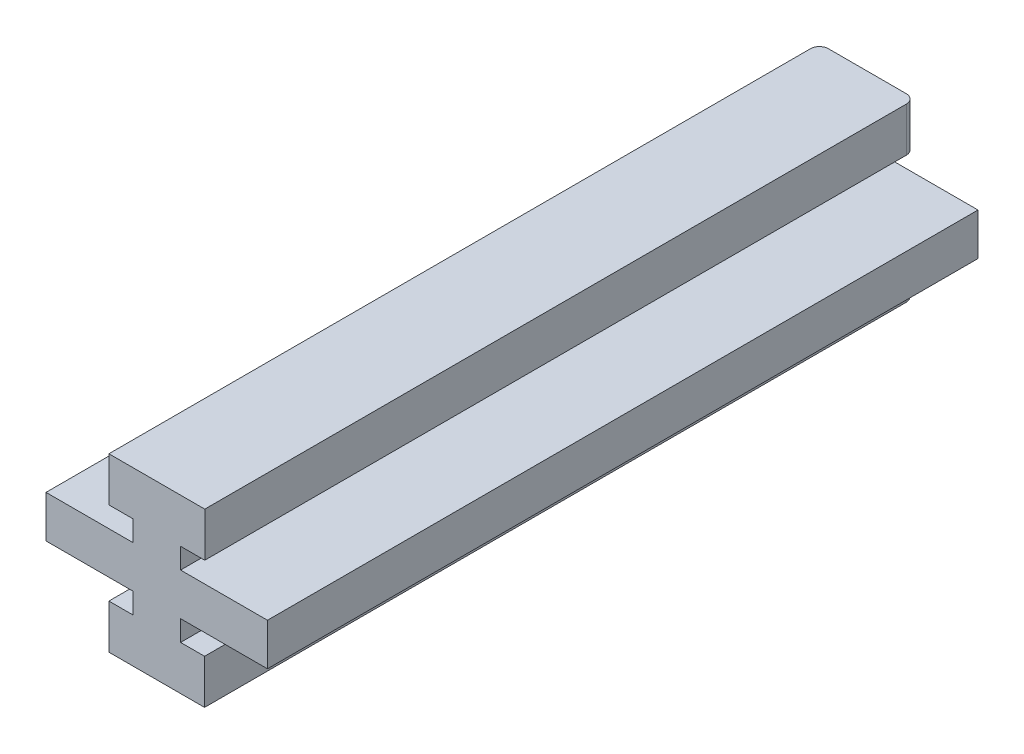
ISO-10303-21;
HEADER;
FILE_DESCRIPTION(('STEP AP214'),'2;1');
FILE_NAME('part.step','',(''),(''),'','','');
FILE_SCHEMA(('AUTOMOTIVE_DESIGN { 1 0 10303 214 1 1 1 1 }'));
ENDSEC;
DATA;
#1=APPLICATION_CONTEXT('core data for automotive mechanical design processes');
#2=APPLICATION_PROTOCOL_DEFINITION('international standard','automotive_design',2000,#1);
#3=PRODUCT_CONTEXT('',#1,'mechanical');
#4=PRODUCT('Part','Part','',(#3));
#5=PRODUCT_RELATED_PRODUCT_CATEGORY('part','',(#4));
#6=PRODUCT_DEFINITION_FORMATION('','',#4);
#7=PRODUCT_DEFINITION_CONTEXT('part definition',#1,'design');
#8=PRODUCT_DEFINITION('design','',#6,#7);
#9=PRODUCT_DEFINITION_SHAPE('','',#8);
#10=(LENGTH_UNIT() NAMED_UNIT(*) SI_UNIT(.MILLI.,.METRE.));
#11=(NAMED_UNIT(*) PLANE_ANGLE_UNIT() SI_UNIT($,.RADIAN.));
#12=(NAMED_UNIT(*) SI_UNIT($,.STERADIAN.) SOLID_ANGLE_UNIT());
#13=UNCERTAINTY_MEASURE_WITH_UNIT(LENGTH_MEASURE(1.E-05),#10,'distance_accuracy_value','');
#14=(GEOMETRIC_REPRESENTATION_CONTEXT(3) GLOBAL_UNCERTAINTY_ASSIGNED_CONTEXT((#13)) GLOBAL_UNIT_ASSIGNED_CONTEXT((#10,
#11,#12)) REPRESENTATION_CONTEXT('',''));
#15=CARTESIAN_POINT('',(0.,0.,0.));
#16=DIRECTION('',(0.,0.,1.));
#17=DIRECTION('',(1.,0.,0.));
#18=AXIS2_PLACEMENT_3D('',#15,#16,#17);
#19=CARTESIAN_POINT('',(1.34599990199997,0.,0.));
#20=DIRECTION('',(1.,0.,0.));
#21=DIRECTION('',(0.,1.,0.));
#22=AXIS2_PLACEMENT_3D('',#19,#20,#21);
#23=PLANE('',#22);
#24=DIRECTION('',(0.,0.,-1.));
#25=VECTOR('',#24,1.);
#26=CARTESIAN_POINT('',(1.345999902,7.1625483,0.));
#27=LINE('',#26,#25);
#28=CARTESIAN_POINT('',(1.345999902,7.1625483,233.1065878));
#29=VERTEX_POINT('',#28);
#30=CARTESIAN_POINT('',(1.345999902,7.1625483,193.508));
#31=VERTEX_POINT('',#30);
#32=EDGE_CURVE('E280',#29,#31,#27,.T.);
#33=ORIENTED_EDGE('',*,*,#32,.F.);
#34=DIRECTION('',(0.,1.,0.));
#35=VECTOR('',#34,1.);
#36=CARTESIAN_POINT('',(1.34599990199999,6.,233.1065878));
#37=LINE('',#36,#35);
#38=CARTESIAN_POINT('',(1.34599990199999,6.,233.1065878));
#39=VERTEX_POINT('',#38);
#40=EDGE_CURVE('E233',#39,#29,#37,.T.);
#41=ORIENTED_EDGE('',*,*,#40,.F.);
#42=DIRECTION('',(0.,0.,-1.));
#43=VECTOR('',#42,1.);
#44=CARTESIAN_POINT('',(1.34599990199999,6.,225.));
#45=LINE('',#44,#43);
#46=CARTESIAN_POINT('',(1.34599990199999,6.,193.508));
#47=VERTEX_POINT('',#46);
#48=EDGE_CURVE('E342',#39,#47,#45,.T.);
#49=ORIENTED_EDGE('',*,*,#48,.T.);
#50=DIRECTION('',(0.,1.,0.));
#51=VECTOR('',#50,1.);
#52=CARTESIAN_POINT('',(1.345999902,7.627,193.508));
#53=LINE('',#52,#51);
#54=EDGE_CURVE('E365',#47,#31,#53,.T.);
#55=ORIENTED_EDGE('',*,*,#54,.T.);
#56=EDGE_LOOP('',(#33,#41,#49,#55));
#57=FACE_BOUND('',#56,.T.);
#58=ADVANCED_FACE('F36',(#57),#23,.T.);
#59=CARTESIAN_POINT('',(-1.34599990199997,0.,0.));
#60=DIRECTION('',(-1.,0.,0.));
#61=DIRECTION('',(0.,1.,0.));
#62=AXIS2_PLACEMENT_3D('',#59,#60,#61);
#63=PLANE('',#62);
#64=DIRECTION('',(0.,0.,1.));
#65=VECTOR('',#64,1.);
#66=CARTESIAN_POINT('',(-1.34599990199995,7.1625483,0.));
#67=LINE('',#66,#65);
#68=CARTESIAN_POINT('',(-1.34599990199995,7.1625483,193.508));
#69=VERTEX_POINT('',#68);
#70=CARTESIAN_POINT('',(-1.34599990199995,7.1625483,233.1065878));
#71=VERTEX_POINT('',#70);
#72=EDGE_CURVE('E276',#69,#71,#67,.T.);
#73=ORIENTED_EDGE('',*,*,#72,.F.);
#74=DIRECTION('',(0.,-1.,0.));
#75=VECTOR('',#74,1.);
#76=CARTESIAN_POINT('',(-1.34599990199996,6.,193.508));
#77=LINE('',#76,#75);
#78=CARTESIAN_POINT('',(-1.34599990199996,6.,193.508));
#79=VERTEX_POINT('',#78);
#80=EDGE_CURVE('E358',#69,#79,#77,.T.);
#81=ORIENTED_EDGE('',*,*,#80,.T.);
#82=DIRECTION('',(0.,0.,-1.));
#83=VECTOR('',#82,1.);
#84=CARTESIAN_POINT('',(-1.34599990199996,6.,225.));
#85=LINE('',#84,#83);
#86=CARTESIAN_POINT('',(-1.34599990199996,6.,233.1065878));
#87=VERTEX_POINT('',#86);
#88=EDGE_CURVE('E327',#87,#79,#85,.T.);
#89=ORIENTED_EDGE('',*,*,#88,.F.);
#90=DIRECTION('',(0.,-1.,0.));
#91=VECTOR('',#90,1.);
#92=CARTESIAN_POINT('',(-1.34599990199995,7.62700000000001,233.1065878));
#93=LINE('',#92,#91);
#94=EDGE_CURVE('E305',#71,#87,#93,.T.);
#95=ORIENTED_EDGE('',*,*,#94,.F.);
#96=EDGE_LOOP('',(#73,#81,#89,#95));
#97=FACE_BOUND('',#96,.T.);
#98=ADVANCED_FACE('F477',(#97),#63,.T.);
#99=CARTESIAN_POINT('',(-6.25,9.20000000000002,225.));
#100=DIRECTION('',(1.,0.,0.));
#101=DIRECTION('',(0.,-1.,0.));
#102=AXIS2_PLACEMENT_3D('',#99,#100,#101);
#103=PLANE('',#102);
#104=DIRECTION('',(0.,0.,1.));
#105=VECTOR('',#104,1.);
#106=CARTESIAN_POINT('',(-6.25,7.1625483,180.276393350966));
#107=LINE('',#106,#105);
#108=CARTESIAN_POINT('',(-6.25,7.1625483,193.));
#109=VERTEX_POINT('',#108);
#110=CARTESIAN_POINT('',(-6.25,7.1625483,233.1065878));
#111=VERTEX_POINT('',#110);
#112=EDGE_CURVE('E257',#109,#111,#107,.T.);
#113=ORIENTED_EDGE('',*,*,#112,.T.);
#114=DIRECTION('',(0.,-1.,0.));
#115=VECTOR('',#114,1.);
#116=CARTESIAN_POINT('',(-6.25,9.07300000000002,233.1065878));
#117=LINE('',#116,#115);
#118=CARTESIAN_POINT('',(-6.25,9.53745169999998,233.1065878));
#119=VERTEX_POINT('',#118);
#120=EDGE_CURVE('E303',#119,#111,#117,.T.);
#121=ORIENTED_EDGE('',*,*,#120,.F.);
#122=DIRECTION('',(0.,0.,1.));
#123=VECTOR('',#122,1.);
#124=CARTESIAN_POINT('',(-6.25,9.53745169999998,180.276393350966));
#125=LINE('',#124,#123);
#126=CARTESIAN_POINT('',(-6.25,9.53745169999998,193.));
#127=VERTEX_POINT('',#126);
#128=EDGE_CURVE('E241',#127,#119,#125,.T.);
#129=ORIENTED_EDGE('',*,*,#128,.F.);
#130=DIRECTION('',(0.,1.,0.));
#131=VECTOR('',#130,1.);
#132=CARTESIAN_POINT('',(-6.25,7.1625483,193.));
#133=LINE('',#132,#131);
#134=EDGE_CURVE('E256',#109,#127,#133,.T.);
#135=ORIENTED_EDGE('',*,*,#134,.F.);
#136=EDGE_LOOP('',(#113,#121,#129,#135));
#137=FACE_BOUND('',#136,.T.);
#138=ADVANCED_FACE('F479',(#137),#103,.F.);
#139=CARTESIAN_POINT('',(2.35000000000005,3.49999999999999,225.));
#140=DIRECTION('',(0.,1.,0.));
#141=DIRECTION('',(1.,0.,0.));
#142=AXIS2_PLACEMENT_3D('',#139,#140,#141);
#143=PLANE('',#142);
#144=DIRECTION('',(1.,0.,0.));
#145=VECTOR('',#144,1.);
#146=CARTESIAN_POINT('',(2.70000000000004,3.49999999999999,233.1065878));
#147=LINE('',#146,#145);
#148=CARTESIAN_POINT('',(-2.70000000000001,3.50000000000001,233.1065878));
#149=VERTEX_POINT('',#148);
#150=CARTESIAN_POINT('',(2.70000000000004,3.49999999999999,233.1065878));
#151=VERTEX_POINT('',#150);
#152=EDGE_CURVE('E282',#149,#151,#147,.T.);
#153=ORIENTED_EDGE('',*,*,#152,.F.);
#154=DIRECTION('',(0.,0.,-1.));
#155=VECTOR('',#154,1.);
#156=CARTESIAN_POINT('',(-2.70000000000001,3.50000000000001,193.));
#157=LINE('',#156,#155);
#158=CARTESIAN_POINT('',(-2.70000000000001,3.50000000000001,193.508));
#159=VERTEX_POINT('',#158);
#160=EDGE_CURVE('E310',#149,#159,#157,.T.);
#161=ORIENTED_EDGE('',*,*,#160,.T.);
#162=CARTESIAN_POINT('',(-2.19200000000001,3.50000000000001,193.508));
#163=DIRECTION('',(0.,1.,0.));
#164=DIRECTION('',(-1.,0.,0.));
#165=AXIS2_PLACEMENT_3D('',#162,#163,#164);
#166=CIRCLE('',#165,0.508);
#167=CARTESIAN_POINT('',(-2.19200000000001,3.50000000000001,193.));
#168=VERTEX_POINT('',#167);
#169=EDGE_CURVE('E368',#159,#168,#166,.F.);
#170=ORIENTED_EDGE('',*,*,#169,.T.);
#171=DIRECTION('',(1.,0.,0.));
#172=VECTOR('',#171,1.);
#173=CARTESIAN_POINT('',(2.35000000000005,3.49999999999999,193.));
#174=LINE('',#173,#172);
#175=CARTESIAN_POINT('',(2.19200000000004,3.49999999999999,193.));
#176=VERTEX_POINT('',#175);
#177=EDGE_CURVE('E355',#168,#176,#174,.T.);
#178=ORIENTED_EDGE('',*,*,#177,.T.);
#179=CARTESIAN_POINT('',(2.19200000000004,3.49999999999999,193.508));
#180=DIRECTION('',(0.,1.,0.));
#181=DIRECTION('',(-1.,0.,0.));
#182=AXIS2_PLACEMENT_3D('',#179,#180,#181);
#183=CIRCLE('',#182,0.508);
#184=CARTESIAN_POINT('',(2.70000000000004,3.49999999999999,193.508));
#185=VERTEX_POINT('',#184);
#186=EDGE_CURVE('E370',#176,#185,#183,.F.);
#187=ORIENTED_EDGE('',*,*,#186,.T.);
#188=DIRECTION('',(0.,0.,1.));
#189=VECTOR('',#188,1.);
#190=CARTESIAN_POINT('',(2.70000000000004,3.49999999999999,193.));
#191=LINE('',#190,#189);
#192=EDGE_CURVE('E314',#185,#151,#191,.T.);
#193=ORIENTED_EDGE('',*,*,#192,.T.);
#194=EDGE_LOOP('',(#153,#161,#170,#178,#187,#193));
#195=FACE_BOUND('',#194,.T.);
#196=ADVANCED_FACE('F450',(#195),#143,.F.);
#197=CARTESIAN_POINT('',(2.65000000000006,5.99999999999999,225.));
#198=DIRECTION('',(0.,-1.,0.));
#199=DIRECTION('',(0.,0.,1.));
#200=AXIS2_PLACEMENT_3D('',#197,#198,#199);
#201=PLANE('',#200);
#202=DIRECTION('',(-1.,0.,0.));
#203=VECTOR('',#202,1.);
#204=CARTESIAN_POINT('',(2.70000000000004,5.99999999999999,233.1065878));
#205=LINE('',#204,#203);
#206=CARTESIAN_POINT('',(2.70000000000004,5.99999999999999,233.1065878));
#207=VERTEX_POINT('',#206);
#208=EDGE_CURVE('E286',#207,#39,#205,.T.);
#209=ORIENTED_EDGE('',*,*,#208,.F.);
#210=DIRECTION('',(0.,0.,-1.));
#211=VECTOR('',#210,1.);
#212=CARTESIAN_POINT('',(2.70000000000004,5.99999999999999,193.));
#213=LINE('',#212,#211);
#214=CARTESIAN_POINT('',(2.70000000000004,5.99999999999999,193.508));
#215=VERTEX_POINT('',#214);
#216=EDGE_CURVE('E311',#207,#215,#213,.T.);
#217=ORIENTED_EDGE('',*,*,#216,.T.);
#218=CARTESIAN_POINT('',(2.19200000000004,5.99999999999999,193.508));
#219=DIRECTION('',(0.,-1.,0.));
#220=DIRECTION('',(1.,0.,0.));
#221=AXIS2_PLACEMENT_3D('',#218,#219,#220);
#222=CIRCLE('',#221,0.508);
#223=CARTESIAN_POINT('',(2.19200000000004,5.99999999999999,193.));
#224=VERTEX_POINT('',#223);
#225=EDGE_CURVE('E380',#215,#224,#222,.F.);
#226=ORIENTED_EDGE('',*,*,#225,.T.);
#227=DIRECTION('',(1.,0.,0.));
#228=VECTOR('',#227,1.);
#229=CARTESIAN_POINT('',(-2.25000000000001,6.00000000000001,193.));
#230=LINE('',#229,#228);
#231=CARTESIAN_POINT('',(0.837999901999992,6.,193.));
#232=VERTEX_POINT('',#231);
#233=EDGE_CURVE('E349',#232,#224,#230,.T.);
#234=ORIENTED_EDGE('',*,*,#233,.F.);
#235=CARTESIAN_POINT('',(0.837999901999992,6.,193.508));
#236=DIRECTION('',(0.,-1.,0.));
#237=DIRECTION('',(1.,0.,0.));
#238=AXIS2_PLACEMENT_3D('',#235,#236,#237);
#239=CIRCLE('',#238,0.508);
#240=EDGE_CURVE('E44',#232,#47,#239,.T.);
#241=ORIENTED_EDGE('',*,*,#240,.T.);
#242=ORIENTED_EDGE('',*,*,#48,.F.);
#243=EDGE_LOOP('',(#209,#217,#226,#234,#241,#242));
#244=FACE_BOUND('',#243,.T.);
#245=ADVANCED_FACE('F427',(#244),#201,.F.);
#246=CARTESIAN_POINT('',(-2.25000000000001,6.00000000000001,225.));
#247=DIRECTION('',(0.,-1.,0.));
#248=DIRECTION('',(1.,0.,0.));
#249=AXIS2_PLACEMENT_3D('',#246,#247,#248);
#250=PLANE('',#249);
#251=DIRECTION('',(-1.,0.,0.));
#252=VECTOR('',#251,1.);
#253=CARTESIAN_POINT('',(-1.34599990199996,6.,233.1065878));
#254=LINE('',#253,#252);
#255=CARTESIAN_POINT('',(-2.70000000000001,6.00000000000001,233.1065878));
#256=VERTEX_POINT('',#255);
#257=EDGE_CURVE('E59',#87,#256,#254,.T.);
#258=ORIENTED_EDGE('',*,*,#257,.F.);
#259=ORIENTED_EDGE('',*,*,#88,.T.);
#260=CARTESIAN_POINT('',(-0.837999901999956,6.,193.508));
#261=DIRECTION('',(0.,-1.,0.));
#262=DIRECTION('',(1.,0.,0.));
#263=AXIS2_PLACEMENT_3D('',#260,#261,#262);
#264=CIRCLE('',#263,0.508);
#265=CARTESIAN_POINT('',(-0.837999901999956,6.,193.));
#266=VERTEX_POINT('',#265);
#267=EDGE_CURVE('E11',#79,#266,#264,.T.);
#268=ORIENTED_EDGE('',*,*,#267,.T.);
#269=DIRECTION('',(-1.,0.,0.));
#270=VECTOR('',#269,1.);
#271=CARTESIAN_POINT('',(-2.25000000000001,6.00000000000001,193.));
#272=LINE('',#271,#270);
#273=CARTESIAN_POINT('',(-2.19200000000001,6.00000000000001,193.));
#274=VERTEX_POINT('',#273);
#275=EDGE_CURVE('E339',#266,#274,#272,.T.);
#276=ORIENTED_EDGE('',*,*,#275,.T.);
#277=CARTESIAN_POINT('',(-2.19200000000001,6.00000000000001,193.508));
#278=DIRECTION('',(0.,-1.,0.));
#279=DIRECTION('',(1.,0.,0.));
#280=AXIS2_PLACEMENT_3D('',#277,#278,#279);
#281=CIRCLE('',#280,0.508);
#282=CARTESIAN_POINT('',(-2.70000000000001,6.00000000000001,193.508));
#283=VERTEX_POINT('',#282);
#284=EDGE_CURVE('E375',#274,#283,#281,.F.);
#285=ORIENTED_EDGE('',*,*,#284,.T.);
#286=DIRECTION('',(0.,0.,1.));
#287=VECTOR('',#286,1.);
#288=CARTESIAN_POINT('',(-2.70000000000001,6.00000000000001,193.));
#289=LINE('',#288,#287);
#290=EDGE_CURVE('E313',#283,#256,#289,.T.);
#291=ORIENTED_EDGE('',*,*,#290,.T.);
#292=EDGE_LOOP('',(#258,#259,#268,#276,#285,#291));
#293=FACE_BOUND('',#292,.T.);
#294=ADVANCED_FACE('F461',(#293),#250,.F.);
#295=CARTESIAN_POINT('',(-2.65000000000004,10.7,225.));
#296=DIRECTION('',(0.,1.,0.));
#297=DIRECTION('',(0.,0.,1.));
#298=AXIS2_PLACEMENT_3D('',#295,#296,#297);
#299=PLANE('',#298);
#300=DIRECTION('',(1.,0.,0.));
#301=VECTOR('',#300,1.);
#302=CARTESIAN_POINT('',(-2.69999999999999,10.7,233.1065878));
#303=LINE('',#302,#301);
#304=CARTESIAN_POINT('',(-2.69999999999999,10.7,233.1065878));
#305=VERTEX_POINT('',#304);
#306=CARTESIAN_POINT('',(-1.34599990199994,10.7,233.1065878));
#307=VERTEX_POINT('',#306);
#308=EDGE_CURVE('E298',#305,#307,#303,.T.);
#309=ORIENTED_EDGE('',*,*,#308,.F.);
#310=DIRECTION('',(0.,0.,-1.));
#311=VECTOR('',#310,1.);
#312=CARTESIAN_POINT('',(-2.69999999999999,10.7,225.));
#313=LINE('',#312,#311);
#314=CARTESIAN_POINT('',(-2.69999999999999,10.7,193.508));
#315=VERTEX_POINT('',#314);
#316=EDGE_CURVE('E324',#305,#315,#313,.T.);
#317=ORIENTED_EDGE('',*,*,#316,.T.);
#318=CARTESIAN_POINT('',(-2.19199999999999,10.7,193.508));
#319=DIRECTION('',(0.,1.,0.));
#320=DIRECTION('',(-1.,0.,0.));
#321=AXIS2_PLACEMENT_3D('',#318,#319,#320);
#322=CIRCLE('',#321,0.508);
#323=CARTESIAN_POINT('',(-2.19199999999999,10.7,193.));
#324=VERTEX_POINT('',#323);
#325=EDGE_CURVE('E389',#315,#324,#322,.F.);
#326=ORIENTED_EDGE('',*,*,#325,.T.);
#327=DIRECTION('',(1.,0.,0.));
#328=VECTOR('',#327,1.);
#329=CARTESIAN_POINT('',(-2.24999999999999,10.7,193.));
#330=LINE('',#329,#328);
#331=CARTESIAN_POINT('',(-0.837999901999945,10.7,193.));
#332=VERTEX_POINT('',#331);
#333=EDGE_CURVE('E334',#324,#332,#330,.T.);
#334=ORIENTED_EDGE('',*,*,#333,.T.);
#335=CARTESIAN_POINT('',(-0.837999901999945,10.7,193.508));
#336=DIRECTION('',(0.,1.,0.));
#337=DIRECTION('',(-1.,0.,0.));
#338=AXIS2_PLACEMENT_3D('',#335,#336,#337);
#339=CIRCLE('',#338,0.508);
#340=CARTESIAN_POINT('',(-1.34599990199994,10.7,193.508));
#341=VERTEX_POINT('',#340);
#342=EDGE_CURVE('E419',#332,#341,#339,.T.);
#343=ORIENTED_EDGE('',*,*,#342,.T.);
#344=DIRECTION('',(0.,0.,1.));
#345=VECTOR('',#344,1.);
#346=CARTESIAN_POINT('',(-1.34599990199994,10.7,225.));
#347=LINE('',#346,#345);
#348=EDGE_CURVE('E331',#341,#307,#347,.T.);
#349=ORIENTED_EDGE('',*,*,#348,.T.);
#350=EDGE_LOOP('',(#309,#317,#326,#334,#343,#349));
#351=FACE_BOUND('',#350,.T.);
#352=ADVANCED_FACE('F524',(#351),#299,.F.);
#353=CARTESIAN_POINT('',(2.25000000000001,10.7,225.));
#354=DIRECTION('',(0.,1.,0.));
#355=DIRECTION('',(1.,0.,0.));
#356=AXIS2_PLACEMENT_3D('',#353,#354,#355);
#357=PLANE('',#356);
#358=DIRECTION('',(1.,0.,0.));
#359=VECTOR('',#358,1.);
#360=CARTESIAN_POINT('',(1.34599990200001,10.7,233.1065878));
#361=LINE('',#360,#359);
#362=CARTESIAN_POINT('',(1.34599990200001,10.7,233.1065878));
#363=VERTEX_POINT('',#362);
#364=CARTESIAN_POINT('',(2.71208564429284,10.7,233.1065878));
#365=VERTEX_POINT('',#364);
#366=EDGE_CURVE('E290',#363,#365,#361,.T.);
#367=ORIENTED_EDGE('',*,*,#366,.F.);
#368=DIRECTION('',(0.,0.,1.));
#369=VECTOR('',#368,1.);
#370=CARTESIAN_POINT('',(1.34599990200001,10.7,225.));
#371=LINE('',#370,#369);
#372=CARTESIAN_POINT('',(1.34599990200001,10.7,193.508));
#373=VERTEX_POINT('',#372);
#374=EDGE_CURVE('E343',#373,#363,#371,.T.);
#375=ORIENTED_EDGE('',*,*,#374,.F.);
#376=CARTESIAN_POINT('',(0.83799990200001,10.7,193.508));
#377=DIRECTION('',(0.,1.,0.));
#378=DIRECTION('',(-1.,0.,0.));
#379=AXIS2_PLACEMENT_3D('',#376,#377,#378);
#380=CIRCLE('',#379,0.508);
#381=CARTESIAN_POINT('',(0.837999902000009,10.7,193.));
#382=VERTEX_POINT('',#381);
#383=EDGE_CURVE('E416',#373,#382,#380,.T.);
#384=ORIENTED_EDGE('',*,*,#383,.T.);
#385=DIRECTION('',(-1.,0.,0.));
#386=VECTOR('',#385,1.);
#387=CARTESIAN_POINT('',(-2.24999999999999,10.7,193.));
#388=LINE('',#387,#386);
#389=CARTESIAN_POINT('',(2.20408564429284,10.7,193.));
#390=VERTEX_POINT('',#389);
#391=EDGE_CURVE('E346',#390,#382,#388,.T.);
#392=ORIENTED_EDGE('',*,*,#391,.F.);
#393=CARTESIAN_POINT('',(2.20408564429284,10.7,193.508));
#394=DIRECTION('',(0.,1.,0.));
#395=DIRECTION('',(-1.,0.,0.));
#396=AXIS2_PLACEMENT_3D('',#393,#394,#395);
#397=CIRCLE('',#396,0.508);
#398=CARTESIAN_POINT('',(2.71208564429284,10.7,193.508));
#399=VERTEX_POINT('',#398);
#400=EDGE_CURVE('E394',#390,#399,#397,.F.);
#401=ORIENTED_EDGE('',*,*,#400,.T.);
#402=DIRECTION('',(0.,0.,1.));
#403=VECTOR('',#402,1.);
#404=CARTESIAN_POINT('',(2.71208564429284,10.7,225.));
#405=LINE('',#404,#403);
#406=EDGE_CURVE('E321',#399,#365,#405,.T.);
#407=ORIENTED_EDGE('',*,*,#406,.T.);
#408=EDGE_LOOP('',(#367,#375,#384,#392,#401,#407));
#409=FACE_BOUND('',#408,.T.);
#410=ADVANCED_FACE('F494',(#409),#357,.F.);
#411=CARTESIAN_POINT('',(2.35000000000007,13.2,225.));
#412=DIRECTION('',(0.,-1.,0.));
#413=DIRECTION('',(1.,0.,0.));
#414=AXIS2_PLACEMENT_3D('',#411,#412,#413);
#415=PLANE('',#414);
#416=DIRECTION('',(-1.,0.,0.));
#417=VECTOR('',#416,1.);
#418=CARTESIAN_POINT('',(2.71208564429285,13.2,233.1065878));
#419=LINE('',#418,#417);
#420=CARTESIAN_POINT('',(2.71208564429285,13.2,233.1065878));
#421=VERTEX_POINT('',#420);
#422=CARTESIAN_POINT('',(-2.69999999999999,13.2,233.1065878));
#423=VERTEX_POINT('',#422);
#424=EDGE_CURVE('E294',#421,#423,#419,.T.);
#425=ORIENTED_EDGE('',*,*,#424,.F.);
#426=DIRECTION('',(0.,0.,-1.));
#427=VECTOR('',#426,1.);
#428=CARTESIAN_POINT('',(2.71208564429285,13.2,225.));
#429=LINE('',#428,#427);
#430=CARTESIAN_POINT('',(2.71208564429285,13.2,193.508));
#431=VERTEX_POINT('',#430);
#432=EDGE_CURVE('E325',#421,#431,#429,.T.);
#433=ORIENTED_EDGE('',*,*,#432,.T.);
#434=CARTESIAN_POINT('',(2.20408564429285,13.2,193.508));
#435=DIRECTION('',(0.,-1.,0.));
#436=DIRECTION('',(1.,0.,0.));
#437=AXIS2_PLACEMENT_3D('',#434,#435,#436);
#438=CIRCLE('',#437,0.508);
#439=CARTESIAN_POINT('',(2.20408564429285,13.2,193.));
#440=VERTEX_POINT('',#439);
#441=EDGE_CURVE('E385',#431,#440,#438,.F.);
#442=ORIENTED_EDGE('',*,*,#441,.T.);
#443=DIRECTION('',(-1.,0.,0.));
#444=VECTOR('',#443,1.);
#445=CARTESIAN_POINT('',(2.35000000000007,13.2,193.));
#446=LINE('',#445,#444);
#447=CARTESIAN_POINT('',(-2.19199999999999,13.2,193.));
#448=VERTEX_POINT('',#447);
#449=EDGE_CURVE('E352',#440,#448,#446,.T.);
#450=ORIENTED_EDGE('',*,*,#449,.T.);
#451=CARTESIAN_POINT('',(-2.19199999999999,13.2,193.508));
#452=DIRECTION('',(0.,-1.,0.));
#453=DIRECTION('',(1.,0.,0.));
#454=AXIS2_PLACEMENT_3D('',#451,#452,#453);
#455=CIRCLE('',#454,0.508);
#456=CARTESIAN_POINT('',(-2.69999999999999,13.2,193.508));
#457=VERTEX_POINT('',#456);
#458=EDGE_CURVE('E387',#448,#457,#455,.F.);
#459=ORIENTED_EDGE('',*,*,#458,.T.);
#460=DIRECTION('',(0.,0.,1.));
#461=VECTOR('',#460,1.);
#462=CARTESIAN_POINT('',(-2.69999999999999,13.2,225.));
#463=LINE('',#462,#461);
#464=EDGE_CURVE('E317',#457,#423,#463,.T.);
#465=ORIENTED_EDGE('',*,*,#464,.T.);
#466=EDGE_LOOP('',(#425,#433,#442,#450,#459,#465));
#467=FACE_BOUND('',#466,.T.);
#468=ADVANCED_FACE('F505',(#467),#415,.F.);
#469=CARTESIAN_POINT('',(6.25,9.19999999999998,225.));
#470=DIRECTION('',(-1.,0.,0.));
#471=DIRECTION('',(0.,1.,0.));
#472=AXIS2_PLACEMENT_3D('',#469,#470,#471);
#473=PLANE('',#472);
#474=DIRECTION('',(0.,1.,0.));
#475=VECTOR('',#474,1.);
#476=CARTESIAN_POINT('',(6.25,9.07299999999998,233.1065878));
#477=LINE('',#476,#475);
#478=CARTESIAN_POINT('',(6.25,7.1625483,233.1065878));
#479=VERTEX_POINT('',#478);
#480=CARTESIAN_POINT('',(6.25,9.53745169999998,233.1065878));
#481=VERTEX_POINT('',#480);
#482=EDGE_CURVE('E220',#479,#481,#477,.T.);
#483=ORIENTED_EDGE('',*,*,#482,.F.);
#484=DIRECTION('',(0.,0.,1.));
#485=VECTOR('',#484,1.);
#486=CARTESIAN_POINT('',(6.25,7.1625483,180.276393350966));
#487=LINE('',#486,#485);
#488=CARTESIAN_POINT('',(6.25,7.1625483,193.));
#489=VERTEX_POINT('',#488);
#490=EDGE_CURVE('E254',#489,#479,#487,.T.);
#491=ORIENTED_EDGE('',*,*,#490,.F.);
#492=DIRECTION('',(0.,-1.,0.));
#493=VECTOR('',#492,1.);
#494=CARTESIAN_POINT('',(6.25,7.1625483,193.));
#495=LINE('',#494,#493);
#496=CARTESIAN_POINT('',(6.25,9.53745169999998,193.));
#497=VERTEX_POINT('',#496);
#498=EDGE_CURVE('E239',#497,#489,#495,.T.);
#499=ORIENTED_EDGE('',*,*,#498,.F.);
#500=DIRECTION('',(0.,0.,1.));
#501=VECTOR('',#500,1.);
#502=CARTESIAN_POINT('',(6.25,9.53745169999998,180.276393350966));
#503=LINE('',#502,#501);
#504=EDGE_CURVE('E237',#497,#481,#503,.T.);
#505=ORIENTED_EDGE('',*,*,#504,.T.);
#506=EDGE_LOOP('',(#483,#491,#499,#505));
#507=FACE_BOUND('',#506,.T.);
#508=ADVANCED_FACE('F238',(#507),#473,.F.);
#509=CARTESIAN_POINT('',(1.34599990199998,0.,0.));
#510=DIRECTION('',(-1.,0.,0.));
#511=DIRECTION('',(0.,-1.,0.));
#512=AXIS2_PLACEMENT_3D('',#509,#510,#511);
#513=PLANE('',#512);
#514=DIRECTION('',(0.,1.,0.));
#515=VECTOR('',#514,1.);
#516=CARTESIAN_POINT('',(1.345999902,9.073,233.1065878));
#517=LINE('',#516,#515);
#518=CARTESIAN_POINT('',(1.34599990200001,9.53745169999998,233.1065878));
#519=VERTEX_POINT('',#518);
#520=EDGE_CURVE('E232',#519,#363,#517,.T.);
#521=ORIENTED_EDGE('',*,*,#520,.F.);
#522=DIRECTION('',(0.,0.,-1.));
#523=VECTOR('',#522,1.);
#524=CARTESIAN_POINT('',(1.34599990200001,9.53745169999998,0.));
#525=LINE('',#524,#523);
#526=CARTESIAN_POINT('',(1.34599990200001,9.53745169999998,193.508));
#527=VERTEX_POINT('',#526);
#528=EDGE_CURVE('E246',#519,#527,#525,.T.);
#529=ORIENTED_EDGE('',*,*,#528,.T.);
#530=DIRECTION('',(0.,-1.,0.));
#531=VECTOR('',#530,1.);
#532=CARTESIAN_POINT('',(1.34599990199998,0.,193.508));
#533=LINE('',#532,#531);
#534=EDGE_CURVE('E363',#527,#373,#533,.F.);
#535=ORIENTED_EDGE('',*,*,#534,.T.);
#536=ORIENTED_EDGE('',*,*,#374,.T.);
#537=EDGE_LOOP('',(#521,#529,#535,#536));
#538=FACE_BOUND('',#537,.T.);
#539=ADVANCED_FACE('F491',(#538),#513,.F.);
#540=CARTESIAN_POINT('',(-1.34599990199998,0.,0.));
#541=DIRECTION('',(1.,0.,0.));
#542=DIRECTION('',(0.,-1.,0.));
#543=AXIS2_PLACEMENT_3D('',#540,#541,#542);
#544=PLANE('',#543);
#545=DIRECTION('',(0.,1.,0.));
#546=VECTOR('',#545,1.);
#547=CARTESIAN_POINT('',(-1.34599990199998,0.,193.508));
#548=LINE('',#547,#546);
#549=CARTESIAN_POINT('',(-1.34599990199995,9.53745169999998,193.508));
#550=VERTEX_POINT('',#549);
#551=EDGE_CURVE('E360',#341,#550,#548,.F.);
#552=ORIENTED_EDGE('',*,*,#551,.T.);
#553=DIRECTION('',(0.,0.,1.));
#554=VECTOR('',#553,1.);
#555=CARTESIAN_POINT('',(-1.34599990199995,9.53745169999998,0.));
#556=LINE('',#555,#554);
#557=CARTESIAN_POINT('',(-1.34599990199995,9.53745169999998,233.1065878));
#558=VERTEX_POINT('',#557);
#559=EDGE_CURVE('E268',#550,#558,#556,.T.);
#560=ORIENTED_EDGE('',*,*,#559,.T.);
#561=DIRECTION('',(0.,-1.,0.));
#562=VECTOR('',#561,1.);
#563=CARTESIAN_POINT('',(-1.34599990199994,10.7,233.1065878));
#564=LINE('',#563,#562);
#565=EDGE_CURVE('E300',#307,#558,#564,.T.);
#566=ORIENTED_EDGE('',*,*,#565,.F.);
#567=ORIENTED_EDGE('',*,*,#348,.F.);
#568=EDGE_LOOP('',(#552,#560,#566,#567));
#569=FACE_BOUND('',#568,.T.);
#570=ADVANCED_FACE('F534',(#569),#544,.F.);
#571=CARTESIAN_POINT('',(2.71208564429275,-21.7544399277073,225.));
#572=DIRECTION('',(1.,0.,0.));
#573=DIRECTION('',(0.,1.,0.));
#574=AXIS2_PLACEMENT_3D('',#571,#572,#573);
#575=PLANE('',#574);
#576=ORIENTED_EDGE('',*,*,#432,.F.);
#577=DIRECTION('',(0.,1.,0.));
#578=VECTOR('',#577,1.);
#579=CARTESIAN_POINT('',(2.71208564429284,10.7,233.1065878));
#580=LINE('',#579,#578);
#581=EDGE_CURVE('E292',#365,#421,#580,.T.);
#582=ORIENTED_EDGE('',*,*,#581,.F.);
#583=ORIENTED_EDGE('',*,*,#406,.F.);
#584=DIRECTION('',(0.,1.,0.));
#585=VECTOR('',#584,1.);
#586=CARTESIAN_POINT('',(2.71208564429285,13.2,193.508));
#587=LINE('',#586,#585);
#588=EDGE_CURVE('E391',#399,#431,#587,.T.);
#589=ORIENTED_EDGE('',*,*,#588,.T.);
#590=EDGE_LOOP('',(#576,#582,#583,#589));
#591=FACE_BOUND('',#590,.T.);
#592=ADVANCED_FACE('F501',(#591),#575,.T.);
#593=CARTESIAN_POINT('',(-2.69999999999999,12.85,225.));
#594=DIRECTION('',(1.,0.,0.));
#595=DIRECTION('',(0.,-1.,0.));
#596=AXIS2_PLACEMENT_3D('',#593,#594,#595);
#597=PLANE('',#596);
#598=DIRECTION('',(0.,-1.,0.));
#599=VECTOR('',#598,1.);
#600=CARTESIAN_POINT('',(-2.69999999999999,13.2,233.1065878));
#601=LINE('',#600,#599);
#602=EDGE_CURVE('E296',#423,#305,#601,.T.);
#603=ORIENTED_EDGE('',*,*,#602,.F.);
#604=ORIENTED_EDGE('',*,*,#464,.F.);
#605=DIRECTION('',(0.,1.,0.));
#606=VECTOR('',#605,1.);
#607=CARTESIAN_POINT('',(-2.69999999999999,12.85,193.508));
#608=LINE('',#607,#606);
#609=EDGE_CURVE('E382',#457,#315,#608,.F.);
#610=ORIENTED_EDGE('',*,*,#609,.T.);
#611=ORIENTED_EDGE('',*,*,#316,.F.);
#612=EDGE_LOOP('',(#603,#604,#610,#611));
#613=FACE_BOUND('',#612,.T.);
#614=ADVANCED_FACE('F518',(#613),#597,.F.);
#615=CARTESIAN_POINT('',(2.70000000000004,3.84999999999999,225.));
#616=DIRECTION('',(-1.,0.,0.));
#617=DIRECTION('',(0.,0.,-1.));
#618=AXIS2_PLACEMENT_3D('',#615,#616,#617);
#619=PLANE('',#618);
#620=DIRECTION('',(0.,1.,0.));
#621=VECTOR('',#620,1.);
#622=CARTESIAN_POINT('',(2.70000000000004,3.49999999999999,233.1065878));
#623=LINE('',#622,#621);
#624=EDGE_CURVE('E284',#151,#207,#623,.T.);
#625=ORIENTED_EDGE('',*,*,#624,.F.);
#626=ORIENTED_EDGE('',*,*,#192,.F.);
#627=DIRECTION('',(0.,-1.,0.));
#628=VECTOR('',#627,1.);
#629=CARTESIAN_POINT('',(2.70000000000004,3.84999999999999,193.508));
#630=LINE('',#629,#628);
#631=EDGE_CURVE('E377',#185,#215,#630,.F.);
#632=ORIENTED_EDGE('',*,*,#631,.T.);
#633=ORIENTED_EDGE('',*,*,#216,.F.);
#634=EDGE_LOOP('',(#625,#626,#632,#633));
#635=FACE_BOUND('',#634,.T.);
#636=ADVANCED_FACE('F438',(#635),#619,.F.);
#637=CARTESIAN_POINT('',(-2.70000000000001,5.95000000000001,225.));
#638=DIRECTION('',(1.,0.,0.));
#639=DIRECTION('',(0.,-1.,0.));
#640=AXIS2_PLACEMENT_3D('',#637,#638,#639);
#641=PLANE('',#640);
#642=DIRECTION('',(0.,-1.,0.));
#643=VECTOR('',#642,1.);
#644=CARTESIAN_POINT('',(-2.70000000000001,6.00000000000001,233.1065878));
#645=LINE('',#644,#643);
#646=EDGE_CURVE('E308',#256,#149,#645,.T.);
#647=ORIENTED_EDGE('',*,*,#646,.F.);
#648=ORIENTED_EDGE('',*,*,#290,.F.);
#649=DIRECTION('',(0.,-1.,0.));
#650=VECTOR('',#649,1.);
#651=CARTESIAN_POINT('',(-2.70000000000001,5.95000000000001,193.508));
#652=LINE('',#651,#650);
#653=EDGE_CURVE('E372',#283,#159,#652,.T.);
#654=ORIENTED_EDGE('',*,*,#653,.T.);
#655=ORIENTED_EDGE('',*,*,#160,.F.);
#656=EDGE_LOOP('',(#647,#648,#654,#655));
#657=FACE_BOUND('',#656,.T.);
#658=ADVANCED_FACE('F459',(#657),#641,.F.);
#659=CARTESIAN_POINT('',(-2.25,6.85000000000001,193.));
#660=DIRECTION('',(0.,0.,1.));
#661=DIRECTION('',(0.,-1.,0.));
#662=AXIS2_PLACEMENT_3D('',#659,#660,#661);
#663=PLANE('',#662);
#664=DIRECTION('',(0.,-1.,0.));
#665=VECTOR('',#664,1.);
#666=CARTESIAN_POINT('',(0.837999901999998,6.85,193.));
#667=LINE('',#666,#665);
#668=CARTESIAN_POINT('',(0.837999902000005,9.53745169999998,193.));
#669=VERTEX_POINT('',#668);
#670=EDGE_CURVE('E403',#382,#669,#667,.T.);
#671=ORIENTED_EDGE('',*,*,#670,.T.);
#672=DIRECTION('',(1.,0.,0.));
#673=VECTOR('',#672,1.);
#674=CARTESIAN_POINT('',(6.25,9.53745169999998,193.));
#675=LINE('',#674,#673);
#676=EDGE_CURVE('E266',#669,#497,#675,.T.);
#677=ORIENTED_EDGE('',*,*,#676,.T.);
#678=ORIENTED_EDGE('',*,*,#498,.T.);
#679=DIRECTION('',(-1.,0.,0.));
#680=VECTOR('',#679,1.);
#681=CARTESIAN_POINT('',(6.25,7.1625483,193.));
#682=LINE('',#681,#680);
#683=CARTESIAN_POINT('',(0.837999901999997,7.1625483,193.));
#684=VERTEX_POINT('',#683);
#685=EDGE_CURVE('E51',#489,#684,#682,.T.);
#686=ORIENTED_EDGE('',*,*,#685,.T.);
#687=DIRECTION('',(0.,1.,0.));
#688=VECTOR('',#687,1.);
#689=CARTESIAN_POINT('',(0.837999901999992,6.,193.));
#690=LINE('',#689,#688);
#691=EDGE_CURVE('E399',#684,#232,#690,.F.);
#692=ORIENTED_EDGE('',*,*,#691,.T.);
#693=ORIENTED_EDGE('',*,*,#233,.T.);
#694=DIRECTION('',(0.,-1.,0.));
#695=VECTOR('',#694,1.);
#696=CARTESIAN_POINT('',(2.19200000000005,6.84999999999999,193.));
#697=LINE('',#696,#695);
#698=EDGE_CURVE('E408',#224,#176,#697,.T.);
#699=ORIENTED_EDGE('',*,*,#698,.T.);
#700=ORIENTED_EDGE('',*,*,#177,.F.);
#701=DIRECTION('',(0.,-1.,0.));
#702=VECTOR('',#701,1.);
#703=CARTESIAN_POINT('',(-2.192,6.85000000000001,193.));
#704=LINE('',#703,#702);
#705=EDGE_CURVE('E406',#168,#274,#704,.F.);
#706=ORIENTED_EDGE('',*,*,#705,.T.);
#707=ORIENTED_EDGE('',*,*,#275,.F.);
#708=DIRECTION('',(0.,-1.,0.));
#709=VECTOR('',#708,1.);
#710=CARTESIAN_POINT('',(-0.837999901999953,7.62700000000001,193.));
#711=LINE('',#710,#709);
#712=CARTESIAN_POINT('',(-0.837999901999953,7.1625483,193.));
#713=VERTEX_POINT('',#712);
#714=EDGE_CURVE('E396',#266,#713,#711,.F.);
#715=ORIENTED_EDGE('',*,*,#714,.T.);
#716=EDGE_CURVE('E465',#713,#109,#682,.T.);
#717=ORIENTED_EDGE('',*,*,#716,.T.);
#718=ORIENTED_EDGE('',*,*,#134,.T.);
#719=CARTESIAN_POINT('',(-0.837999901999949,9.53745169999998,193.));
#720=VERTEX_POINT('',#719);
#721=EDGE_CURVE('E262',#127,#720,#675,.T.);
#722=ORIENTED_EDGE('',*,*,#721,.T.);
#723=DIRECTION('',(0.,1.,0.));
#724=VECTOR('',#723,1.);
#725=CARTESIAN_POINT('',(-0.837999901999956,6.85,193.));
#726=LINE('',#725,#724);
#727=EDGE_CURVE('E401',#720,#332,#726,.T.);
#728=ORIENTED_EDGE('',*,*,#727,.T.);
#729=ORIENTED_EDGE('',*,*,#333,.F.);
#730=DIRECTION('',(0.,1.,0.));
#731=VECTOR('',#730,1.);
#732=CARTESIAN_POINT('',(-2.192,6.85000000000001,193.));
#733=LINE('',#732,#731);
#734=EDGE_CURVE('E413',#324,#448,#733,.T.);
#735=ORIENTED_EDGE('',*,*,#734,.T.);
#736=ORIENTED_EDGE('',*,*,#449,.F.);
#737=DIRECTION('',(0.,1.,0.));
#738=VECTOR('',#737,1.);
#739=CARTESIAN_POINT('',(2.20408564429284,10.7,193.));
#740=LINE('',#739,#738);
#741=EDGE_CURVE('E411',#440,#390,#740,.F.);
#742=ORIENTED_EDGE('',*,*,#741,.T.);
#743=ORIENTED_EDGE('',*,*,#391,.T.);
#744=EDGE_LOOP('',(#671,#677,#678,#686,#692,#693,#699,#700,#706,#707,#715,#717,#718,#722,#728,
#729,#735,#736,#742,#743));
#745=FACE_BOUND('',#744,.T.);
#746=ADVANCED_FACE('F445',(#745),#663,.F.);
#747=CARTESIAN_POINT('',(-2.192,6.85000000000001,193.508));
#748=DIRECTION('',(0.,1.,0.));
#749=DIRECTION('',(-1.,0.,0.));
#750=AXIS2_PLACEMENT_3D('',#747,#748,#749);
#751=CYLINDRICAL_SURFACE('',#750,0.508);
#752=ORIENTED_EDGE('',*,*,#325,.F.);
#753=ORIENTED_EDGE('',*,*,#609,.F.);
#754=ORIENTED_EDGE('',*,*,#458,.F.);
#755=ORIENTED_EDGE('',*,*,#734,.F.);
#756=EDGE_LOOP('',(#752,#753,#754,#755));
#757=FACE_BOUND('',#756,.T.);
#758=ADVANCED_FACE('F521',(#757),#751,.T.);
#759=CARTESIAN_POINT('',(2.20408564429275,-21.7544399277073,193.508));
#760=DIRECTION('',(0.,-1.,0.));
#761=DIRECTION('',(1.,0.,0.));
#762=AXIS2_PLACEMENT_3D('',#759,#760,#761);
#763=CYLINDRICAL_SURFACE('',#762,0.508);
#764=ORIENTED_EDGE('',*,*,#400,.F.);
#765=ORIENTED_EDGE('',*,*,#741,.F.);
#766=ORIENTED_EDGE('',*,*,#441,.F.);
#767=ORIENTED_EDGE('',*,*,#588,.F.);
#768=EDGE_LOOP('',(#764,#765,#766,#767));
#769=FACE_BOUND('',#768,.T.);
#770=ADVANCED_FACE('F510',(#769),#763,.T.);
#771=CARTESIAN_POINT('',(2.19200000000005,6.84999999999999,193.508));
#772=DIRECTION('',(0.,-1.,0.));
#773=DIRECTION('',(1.,0.,0.));
#774=AXIS2_PLACEMENT_3D('',#771,#772,#773);
#775=CYLINDRICAL_SURFACE('',#774,0.508);
#776=ORIENTED_EDGE('',*,*,#225,.F.);
#777=ORIENTED_EDGE('',*,*,#631,.F.);
#778=ORIENTED_EDGE('',*,*,#186,.F.);
#779=ORIENTED_EDGE('',*,*,#698,.F.);
#780=EDGE_LOOP('',(#776,#777,#778,#779));
#781=FACE_BOUND('',#780,.T.);
#782=ADVANCED_FACE('F444',(#781),#775,.T.);
#783=CARTESIAN_POINT('',(-2.19200000000001,5.95000000000001,193.508));
#784=DIRECTION('',(0.,-1.,0.));
#785=DIRECTION('',(1.,0.,0.));
#786=AXIS2_PLACEMENT_3D('',#783,#784,#785);
#787=CYLINDRICAL_SURFACE('',#786,0.508);
#788=ORIENTED_EDGE('',*,*,#284,.F.);
#789=ORIENTED_EDGE('',*,*,#705,.F.);
#790=ORIENTED_EDGE('',*,*,#169,.F.);
#791=ORIENTED_EDGE('',*,*,#653,.F.);
#792=EDGE_LOOP('',(#788,#789,#790,#791));
#793=FACE_BOUND('',#792,.T.);
#794=ADVANCED_FACE('F456',(#793),#787,.T.);
#795=CARTESIAN_POINT('',(0.837999901999997,6.85,193.508));
#796=DIRECTION('',(0.,-1.,0.));
#797=DIRECTION('',(1.,0.,0.));
#798=AXIS2_PLACEMENT_3D('',#795,#796,#797);
#799=CYLINDRICAL_SURFACE('',#798,0.508);
#800=CARTESIAN_POINT('',(0.837999902000006,9.53745169999998,193.508));
#801=DIRECTION('',(0.,1.,0.));
#802=DIRECTION('',(-1.,0.,0.));
#803=AXIS2_PLACEMENT_3D('',#800,#801,#802);
#804=CIRCLE('',#803,0.508);
#805=EDGE_CURVE('E271',#669,#527,#804,.F.);
#806=ORIENTED_EDGE('',*,*,#805,.F.);
#807=ORIENTED_EDGE('',*,*,#670,.F.);
#808=ORIENTED_EDGE('',*,*,#383,.F.);
#809=ORIENTED_EDGE('',*,*,#534,.F.);
#810=EDGE_LOOP('',(#806,#807,#808,#809));
#811=FACE_BOUND('',#810,.T.);
#812=ADVANCED_FACE('F487',(#811),#799,.T.);
#813=CARTESIAN_POINT('',(-0.837999901999956,6.85,193.508));
#814=DIRECTION('',(0.,1.,0.));
#815=DIRECTION('',(-1.,0.,0.));
#816=AXIS2_PLACEMENT_3D('',#813,#814,#815);
#817=CYLINDRICAL_SURFACE('',#816,0.508);
#818=CARTESIAN_POINT('',(-0.837999901999949,9.53745169999998,193.508));
#819=DIRECTION('',(0.,1.,0.));
#820=DIRECTION('',(-1.,0.,0.));
#821=AXIS2_PLACEMENT_3D('',#818,#819,#820);
#822=CIRCLE('',#821,0.508);
#823=EDGE_CURVE('E265',#550,#720,#822,.F.);
#824=ORIENTED_EDGE('',*,*,#823,.F.);
#825=ORIENTED_EDGE('',*,*,#551,.F.);
#826=ORIENTED_EDGE('',*,*,#342,.F.);
#827=ORIENTED_EDGE('',*,*,#727,.F.);
#828=EDGE_LOOP('',(#824,#825,#826,#827));
#829=FACE_BOUND('',#828,.T.);
#830=ADVANCED_FACE('F529',(#829),#817,.T.);
#831=CARTESIAN_POINT('',(0.83799990199997,0.,193.508));
#832=DIRECTION('',(0.,-1.,0.));
#833=DIRECTION('',(1.,0.,0.));
#834=AXIS2_PLACEMENT_3D('',#831,#832,#833);
#835=CYLINDRICAL_SURFACE('',#834,0.508);
#836=CARTESIAN_POINT('',(0.837999901999997,7.1625483,193.508));
#837=DIRECTION('',(0.,-1.,0.));
#838=DIRECTION('',(1.,0.,0.));
#839=AXIS2_PLACEMENT_3D('',#836,#837,#838);
#840=CIRCLE('',#839,0.508);
#841=EDGE_CURVE('E278',#31,#684,#840,.F.);
#842=ORIENTED_EDGE('',*,*,#841,.F.);
#843=ORIENTED_EDGE('',*,*,#54,.F.);
#844=ORIENTED_EDGE('',*,*,#240,.F.);
#845=ORIENTED_EDGE('',*,*,#691,.F.);
#846=EDGE_LOOP('',(#842,#843,#844,#845));
#847=FACE_BOUND('',#846,.T.);
#848=ADVANCED_FACE('F431',(#847),#835,.T.);
#849=CARTESIAN_POINT('',(-0.83799990199997,0.,193.508));
#850=DIRECTION('',(0.,1.,0.));
#851=DIRECTION('',(-1.,0.,0.));
#852=AXIS2_PLACEMENT_3D('',#849,#850,#851);
#853=CYLINDRICAL_SURFACE('',#852,0.508);
#854=CARTESIAN_POINT('',(-0.837999901999954,7.1625483,193.508));
#855=DIRECTION('',(0.,-1.,0.));
#856=DIRECTION('',(1.,0.,0.));
#857=AXIS2_PLACEMENT_3D('',#854,#855,#856);
#858=CIRCLE('',#857,0.508);
#859=EDGE_CURVE('E274',#713,#69,#858,.F.);
#860=ORIENTED_EDGE('',*,*,#859,.F.);
#861=ORIENTED_EDGE('',*,*,#714,.F.);
#862=ORIENTED_EDGE('',*,*,#267,.F.);
#863=ORIENTED_EDGE('',*,*,#80,.F.);
#864=EDGE_LOOP('',(#860,#861,#862,#863));
#865=FACE_BOUND('',#864,.T.);
#866=ADVANCED_FACE('F38',(#865),#853,.T.);
#867=CARTESIAN_POINT('',(0.,0.,233.1065878));
#868=DIRECTION('',(0.,0.,1.));
#869=DIRECTION('',(1.,0.,0.));
#870=AXIS2_PLACEMENT_3D('',#867,#868,#869);
#871=PLANE('',#870);
#872=DIRECTION('',(1.,0.,0.));
#873=VECTOR('',#872,1.);
#874=CARTESIAN_POINT('',(6.25,7.1625483,233.1065878));
#875=LINE('',#874,#873);
#876=EDGE_CURVE('E242',#111,#71,#875,.T.);
#877=ORIENTED_EDGE('',*,*,#876,.T.);
#878=ORIENTED_EDGE('',*,*,#94,.T.);
#879=ORIENTED_EDGE('',*,*,#257,.T.);
#880=ORIENTED_EDGE('',*,*,#646,.T.);
#881=ORIENTED_EDGE('',*,*,#152,.T.);
#882=ORIENTED_EDGE('',*,*,#624,.T.);
#883=ORIENTED_EDGE('',*,*,#208,.T.);
#884=ORIENTED_EDGE('',*,*,#40,.T.);
#885=EDGE_CURVE('E228',#29,#479,#875,.T.);
#886=ORIENTED_EDGE('',*,*,#885,.T.);
#887=ORIENTED_EDGE('',*,*,#482,.T.);
#888=DIRECTION('',(-1.,0.,0.));
#889=VECTOR('',#888,1.);
#890=CARTESIAN_POINT('',(6.25,9.53745169999998,233.1065878));
#891=LINE('',#890,#889);
#892=EDGE_CURVE('E225',#481,#519,#891,.T.);
#893=ORIENTED_EDGE('',*,*,#892,.T.);
#894=ORIENTED_EDGE('',*,*,#520,.T.);
#895=ORIENTED_EDGE('',*,*,#366,.T.);
#896=ORIENTED_EDGE('',*,*,#581,.T.);
#897=ORIENTED_EDGE('',*,*,#424,.T.);
#898=ORIENTED_EDGE('',*,*,#602,.T.);
#899=ORIENTED_EDGE('',*,*,#308,.T.);
#900=ORIENTED_EDGE('',*,*,#565,.T.);
#901=EDGE_CURVE('E247',#558,#119,#891,.T.);
#902=ORIENTED_EDGE('',*,*,#901,.T.);
#903=ORIENTED_EDGE('',*,*,#120,.T.);
#904=EDGE_LOOP('',(#877,#878,#879,#880,#881,#882,#883,#884,#886,#887,#893,#894,#895,#896,#897,
#898,#899,#900,#902,#903));
#905=FACE_BOUND('',#904,.T.);
#906=ADVANCED_FACE('F223',(#905),#871,.T.);
#907=CARTESIAN_POINT('',(6.25,7.1625483,180.276393350966));
#908=DIRECTION('',(0.,-1.,0.));
#909=DIRECTION('',(1.,0.,0.));
#910=AXIS2_PLACEMENT_3D('',#907,#908,#909);
#911=PLANE('',#910);
#912=ORIENTED_EDGE('',*,*,#859,.T.);
#913=ORIENTED_EDGE('',*,*,#72,.T.);
#914=ORIENTED_EDGE('',*,*,#876,.F.);
#915=ORIENTED_EDGE('',*,*,#112,.F.);
#916=ORIENTED_EDGE('',*,*,#716,.F.);
#917=EDGE_LOOP('',(#912,#913,#914,#915,#916));
#918=FACE_BOUND('',#917,.T.);
#919=ADVANCED_FACE('F472',(#918),#911,.T.);
#920=CARTESIAN_POINT('',(6.25,9.53745169999998,180.276393350966));
#921=DIRECTION('',(0.,1.,0.));
#922=DIRECTION('',(-1.,0.,0.));
#923=AXIS2_PLACEMENT_3D('',#920,#921,#922);
#924=PLANE('',#923);
#925=ORIENTED_EDGE('',*,*,#559,.F.);
#926=ORIENTED_EDGE('',*,*,#823,.T.);
#927=ORIENTED_EDGE('',*,*,#721,.F.);
#928=ORIENTED_EDGE('',*,*,#128,.T.);
#929=ORIENTED_EDGE('',*,*,#901,.F.);
#930=EDGE_LOOP('',(#925,#926,#927,#928,#929));
#931=FACE_BOUND('',#930,.T.);
#932=ADVANCED_FACE('F536',(#931),#924,.T.);
#933=ORIENTED_EDGE('',*,*,#885,.F.);
#934=ORIENTED_EDGE('',*,*,#32,.T.);
#935=ORIENTED_EDGE('',*,*,#841,.T.);
#936=ORIENTED_EDGE('',*,*,#685,.F.);
#937=ORIENTED_EDGE('',*,*,#490,.T.);
#938=EDGE_LOOP('',(#933,#934,#935,#936,#937));
#939=FACE_BOUND('',#938,.T.);
#940=ADVANCED_FACE('F538',(#939),#911,.T.);
#941=ORIENTED_EDGE('',*,*,#528,.F.);
#942=ORIENTED_EDGE('',*,*,#892,.F.);
#943=ORIENTED_EDGE('',*,*,#504,.F.);
#944=ORIENTED_EDGE('',*,*,#676,.F.);
#945=ORIENTED_EDGE('',*,*,#805,.T.);
#946=EDGE_LOOP('',(#941,#942,#943,#944,#945));
#947=FACE_BOUND('',#946,.T.);
#948=ADVANCED_FACE('F244',(#947),#924,.T.);
#949=CLOSED_SHELL('',(#58,#98,#138,#196,#245,#294,#352,#410,#468,#508,#539,#570,#592,#614,#636,
#658,#746,#758,#770,#782,#794,#812,#830,#848,#866,#906,#919,#932,#940,#948));
#950=MANIFOLD_SOLID_BREP('B2',#949);
#951=ADVANCED_BREP_SHAPE_REPRESENTATION('',(#18,#950),#14);
#952=SHAPE_DEFINITION_REPRESENTATION(#9,#951);
ENDSEC;
END-ISO-10303-21;
